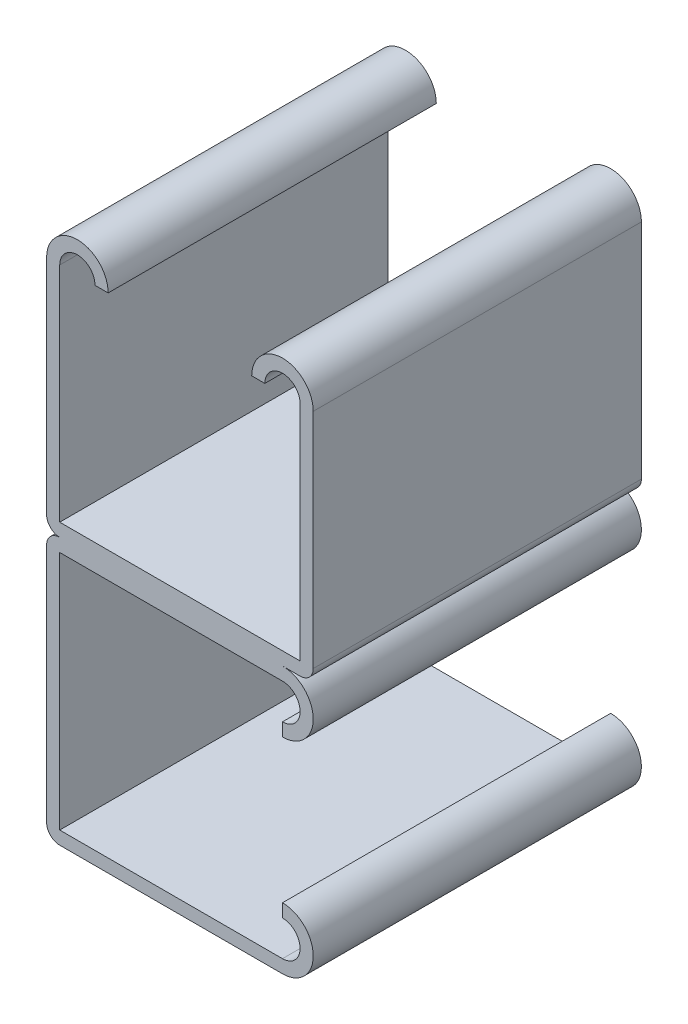
ISO-10303-21;
HEADER;
FILE_DESCRIPTION(('STEP AP214'),'2;1');
FILE_NAME('part.step','',(''),(''),'','','');
FILE_SCHEMA(('AUTOMOTIVE_DESIGN { 1 0 10303 214 1 1 1 1 }'));
ENDSEC;
DATA;
#1=APPLICATION_CONTEXT('core data for automotive mechanical design processes');
#2=APPLICATION_PROTOCOL_DEFINITION('international standard','automotive_design',2000,#1);
#3=PRODUCT_CONTEXT('',#1,'mechanical');
#4=PRODUCT('Part','Part','',(#3));
#5=PRODUCT_RELATED_PRODUCT_CATEGORY('part','',(#4));
#6=PRODUCT_DEFINITION_FORMATION('','',#4);
#7=PRODUCT_DEFINITION_CONTEXT('part definition',#1,'design');
#8=PRODUCT_DEFINITION('design','',#6,#7);
#9=PRODUCT_DEFINITION_SHAPE('','',#8);
#10=(LENGTH_UNIT() NAMED_UNIT(*) SI_UNIT(.MILLI.,.METRE.));
#11=(NAMED_UNIT(*) PLANE_ANGLE_UNIT() SI_UNIT($,.RADIAN.));
#12=(NAMED_UNIT(*) SI_UNIT($,.STERADIAN.) SOLID_ANGLE_UNIT());
#13=UNCERTAINTY_MEASURE_WITH_UNIT(LENGTH_MEASURE(1.E-05),#10,'distance_accuracy_value','');
#14=(GEOMETRIC_REPRESENTATION_CONTEXT(3) GLOBAL_UNCERTAINTY_ASSIGNED_CONTEXT((#13)) GLOBAL_UNIT_ASSIGNED_CONTEXT((#10,
#11,#12)) REPRESENTATION_CONTEXT('',''));
#15=CARTESIAN_POINT('',(0.,0.,0.));
#16=DIRECTION('',(0.,0.,1.));
#17=DIRECTION('',(1.,0.,0.));
#18=AXIS2_PLACEMENT_3D('',#15,#16,#17);
#19=CARTESIAN_POINT('',(1.016,0.,12.7));
#20=DIRECTION('',(0.,1.,0.));
#21=DIRECTION('',(0.,0.,1.));
#22=AXIS2_PLACEMENT_3D('',#19,#20,#21);
#23=PLANE('',#22);
#24=DIRECTION('',(0.,0.,-1.));
#25=VECTOR('',#24,1.);
#26=CARTESIAN_POINT('',(18.25625,1.89923025969782E-13,12.7));
#27=LINE('',#26,#25);
#28=CARTESIAN_POINT('',(18.25625,0.,12.7));
#29=VERTEX_POINT('',#28);
#30=CARTESIAN_POINT('',(18.25625,1.89923025969782E-13,-12.7));
#31=VERTEX_POINT('',#30);
#32=EDGE_CURVE('E180',#29,#31,#27,.T.);
#33=ORIENTED_EDGE('',*,*,#32,.T.);
#34=DIRECTION('',(1.,0.,0.));
#35=VECTOR('',#34,1.);
#36=CARTESIAN_POINT('',(1.016,0.,-12.7));
#37=LINE('',#36,#35);
#38=CARTESIAN_POINT('',(19.6215,0.,-12.7));
#39=VERTEX_POINT('',#38);
#40=EDGE_CURVE('E184',#31,#39,#37,.T.);
#41=ORIENTED_EDGE('',*,*,#40,.T.);
#42=DIRECTION('',(0.,0.,-1.));
#43=VECTOR('',#42,1.);
#44=CARTESIAN_POINT('',(19.6215,0.,12.7));
#45=LINE('',#44,#43);
#46=CARTESIAN_POINT('',(19.6215,0.,12.7));
#47=VERTEX_POINT('',#46);
#48=EDGE_CURVE('E226',#47,#39,#45,.T.);
#49=ORIENTED_EDGE('',*,*,#48,.F.);
#50=DIRECTION('',(1.,0.,0.));
#51=VECTOR('',#50,1.);
#52=CARTESIAN_POINT('',(1.016,0.,12.7));
#53=LINE('',#52,#51);
#54=EDGE_CURVE('E47',#29,#47,#53,.T.);
#55=ORIENTED_EDGE('',*,*,#54,.F.);
#56=EDGE_LOOP('',(#33,#41,#49,#55));
#57=FACE_BOUND('',#56,.T.);
#58=ADVANCED_FACE('F32',(#57),#23,.F.);
#59=CARTESIAN_POINT('',(2.38125,18.25625,12.7));
#60=DIRECTION('',(0.,0.,-1.));
#61=DIRECTION('',(-1.,0.,0.));
#62=AXIS2_PLACEMENT_3D('',#59,#60,#61);
#63=CYLINDRICAL_SURFACE('',#62,2.38125);
#64=CARTESIAN_POINT('',(2.38125,18.25625,-12.7));
#65=DIRECTION('',(0.,0.,1.));
#66=DIRECTION('',(-1.,0.,0.));
#67=AXIS2_PLACEMENT_3D('',#64,#65,#66);
#68=CIRCLE('',#67,2.38125);
#69=CARTESIAN_POINT('',(4.7625,18.25625,-12.7));
#70=VERTEX_POINT('',#69);
#71=CARTESIAN_POINT('',(0.,18.25625,-12.7));
#72=VERTEX_POINT('',#71);
#73=EDGE_CURVE('E176',#70,#72,#68,.T.);
#74=ORIENTED_EDGE('',*,*,#73,.T.);
#75=DIRECTION('',(0.,0.,-1.));
#76=VECTOR('',#75,1.);
#77=CARTESIAN_POINT('',(0.,18.25625,12.7));
#78=LINE('',#77,#76);
#79=CARTESIAN_POINT('',(0.,18.25625,12.7));
#80=VERTEX_POINT('',#79);
#81=EDGE_CURVE('E11',#80,#72,#78,.T.);
#82=ORIENTED_EDGE('',*,*,#81,.F.);
#83=CARTESIAN_POINT('',(2.38125,18.25625,12.7));
#84=DIRECTION('',(0.,0.,1.));
#85=DIRECTION('',(-1.,0.,0.));
#86=AXIS2_PLACEMENT_3D('',#83,#84,#85);
#87=CIRCLE('',#86,2.38125);
#88=CARTESIAN_POINT('',(4.7625,18.25625,12.7));
#89=VERTEX_POINT('',#88);
#90=EDGE_CURVE('E204',#89,#80,#87,.T.);
#91=ORIENTED_EDGE('',*,*,#90,.F.);
#92=DIRECTION('',(0.,0.,-1.));
#93=VECTOR('',#92,1.);
#94=CARTESIAN_POINT('',(4.7625,18.25625,12.7));
#95=LINE('',#94,#93);
#96=EDGE_CURVE('E172',#89,#70,#95,.T.);
#97=ORIENTED_EDGE('',*,*,#96,.T.);
#98=EDGE_LOOP('',(#74,#82,#91,#97));
#99=FACE_BOUND('',#98,.T.);
#100=ADVANCED_FACE('F34',(#99),#63,.T.);
#101=CARTESIAN_POINT('',(0.,18.25625,12.7));
#102=DIRECTION('',(1.,0.,0.));
#103=DIRECTION('',(0.,1.,0.));
#104=AXIS2_PLACEMENT_3D('',#101,#102,#103);
#105=PLANE('',#104);
#106=DIRECTION('',(0.,-1.,0.));
#107=VECTOR('',#106,1.);
#108=CARTESIAN_POINT('',(0.,18.25625,-12.7));
#109=LINE('',#108,#107);
#110=CARTESIAN_POINT('',(0.,1.016,-12.7));
#111=VERTEX_POINT('',#110);
#112=EDGE_CURVE('E179',#72,#111,#109,.T.);
#113=ORIENTED_EDGE('',*,*,#112,.T.);
#114=DIRECTION('',(0.,0.,-1.));
#115=VECTOR('',#114,1.);
#116=CARTESIAN_POINT('',(0.,1.016,12.7));
#117=LINE('',#116,#115);
#118=CARTESIAN_POINT('',(0.,1.016,12.7));
#119=VERTEX_POINT('',#118);
#120=EDGE_CURVE('E40',#119,#111,#117,.T.);
#121=ORIENTED_EDGE('',*,*,#120,.F.);
#122=DIRECTION('',(0.,-1.,0.));
#123=VECTOR('',#122,1.);
#124=CARTESIAN_POINT('',(0.,18.25625,12.7));
#125=LINE('',#124,#123);
#126=EDGE_CURVE('E115',#80,#119,#125,.T.);
#127=ORIENTED_EDGE('',*,*,#126,.F.);
#128=ORIENTED_EDGE('',*,*,#81,.T.);
#129=EDGE_LOOP('',(#113,#121,#127,#128));
#130=FACE_BOUND('',#129,.T.);
#131=ADVANCED_FACE('F511',(#130),#105,.F.);
#132=CARTESIAN_POINT('',(1.016,1.016,12.7));
#133=DIRECTION('',(0.,0.,-1.));
#134=DIRECTION('',(-1.,0.,0.));
#135=AXIS2_PLACEMENT_3D('',#132,#133,#134);
#136=CYLINDRICAL_SURFACE('',#135,1.016);
#137=CARTESIAN_POINT('',(1.016,1.016,-12.7));
#138=DIRECTION('',(0.,0.,1.));
#139=DIRECTION('',(-1.,0.,0.));
#140=AXIS2_PLACEMENT_3D('',#137,#138,#139);
#141=CIRCLE('',#140,1.016);
#142=CARTESIAN_POINT('',(1.016,0.,-12.7));
#143=VERTEX_POINT('',#142);
#144=EDGE_CURVE('E182',#111,#143,#141,.T.);
#145=ORIENTED_EDGE('',*,*,#144,.T.);
#146=DIRECTION('',(0.,0.,-1.));
#147=VECTOR('',#146,1.);
#148=CARTESIAN_POINT('',(1.016,0.,12.7));
#149=LINE('',#148,#147);
#150=CARTESIAN_POINT('',(1.016,0.,12.7));
#151=VERTEX_POINT('',#150);
#152=EDGE_CURVE('E229',#151,#143,#149,.T.);
#153=ORIENTED_EDGE('',*,*,#152,.F.);
#154=CARTESIAN_POINT('',(1.016,1.016,12.7));
#155=DIRECTION('',(0.,0.,1.));
#156=DIRECTION('',(-1.,0.,0.));
#157=AXIS2_PLACEMENT_3D('',#154,#155,#156);
#158=CIRCLE('',#157,1.016);
#159=EDGE_CURVE('E237',#119,#151,#158,.T.);
#160=ORIENTED_EDGE('',*,*,#159,.F.);
#161=ORIENTED_EDGE('',*,*,#120,.T.);
#162=EDGE_LOOP('',(#145,#153,#160,#161));
#163=FACE_BOUND('',#162,.T.);
#164=ADVANCED_FACE('F235',(#163),#136,.T.);
#165=CARTESIAN_POINT('',(19.6215,1.016,12.7));
#166=DIRECTION('',(0.,0.,-1.));
#167=DIRECTION('',(-1.,0.,0.));
#168=AXIS2_PLACEMENT_3D('',#165,#166,#167);
#169=CYLINDRICAL_SURFACE('',#168,1.016);
#170=CARTESIAN_POINT('',(19.6215,1.016,-12.7));
#171=DIRECTION('',(0.,0.,1.));
#172=DIRECTION('',(1.,0.,0.));
#173=AXIS2_PLACEMENT_3D('',#170,#171,#172);
#174=CIRCLE('',#173,1.016);
#175=CARTESIAN_POINT('',(20.6375,1.016,-12.7));
#176=VERTEX_POINT('',#175);
#177=EDGE_CURVE('E186',#39,#176,#174,.T.);
#178=ORIENTED_EDGE('',*,*,#177,.T.);
#179=DIRECTION('',(0.,0.,-1.));
#180=VECTOR('',#179,1.);
#181=CARTESIAN_POINT('',(20.6375,1.016,12.7));
#182=LINE('',#181,#180);
#183=CARTESIAN_POINT('',(20.6375,1.016,12.7));
#184=VERTEX_POINT('',#183);
#185=EDGE_CURVE('E223',#184,#176,#182,.T.);
#186=ORIENTED_EDGE('',*,*,#185,.F.);
#187=CARTESIAN_POINT('',(19.6215,1.016,12.7));
#188=DIRECTION('',(0.,0.,1.));
#189=DIRECTION('',(1.,0.,0.));
#190=AXIS2_PLACEMENT_3D('',#187,#188,#189);
#191=CIRCLE('',#190,1.016);
#192=EDGE_CURVE('E331',#47,#184,#191,.T.);
#193=ORIENTED_EDGE('',*,*,#192,.F.);
#194=ORIENTED_EDGE('',*,*,#48,.T.);
#195=EDGE_LOOP('',(#178,#186,#193,#194));
#196=FACE_BOUND('',#195,.T.);
#197=ADVANCED_FACE('F514',(#196),#169,.T.);
#198=CARTESIAN_POINT('',(20.6375,1.016,12.7));
#199=DIRECTION('',(-1.,0.,0.));
#200=DIRECTION('',(0.,-1.,0.));
#201=AXIS2_PLACEMENT_3D('',#198,#199,#200);
#202=PLANE('',#201);
#203=DIRECTION('',(0.,1.,0.));
#204=VECTOR('',#203,1.);
#205=CARTESIAN_POINT('',(20.6375,1.016,-12.7));
#206=LINE('',#205,#204);
#207=CARTESIAN_POINT('',(20.6375,18.25625,-12.7));
#208=VERTEX_POINT('',#207);
#209=EDGE_CURVE('E188',#176,#208,#206,.T.);
#210=ORIENTED_EDGE('',*,*,#209,.T.);
#211=DIRECTION('',(0.,0.,-1.));
#212=VECTOR('',#211,1.);
#213=CARTESIAN_POINT('',(20.6375,18.25625,12.7));
#214=LINE('',#213,#212);
#215=CARTESIAN_POINT('',(20.6375,18.25625,12.7));
#216=VERTEX_POINT('',#215);
#217=EDGE_CURVE('E220',#216,#208,#214,.T.);
#218=ORIENTED_EDGE('',*,*,#217,.F.);
#219=DIRECTION('',(0.,1.,0.));
#220=VECTOR('',#219,1.);
#221=CARTESIAN_POINT('',(20.6375,1.016,12.7));
#222=LINE('',#221,#220);
#223=EDGE_CURVE('E333',#184,#216,#222,.T.);
#224=ORIENTED_EDGE('',*,*,#223,.F.);
#225=ORIENTED_EDGE('',*,*,#185,.T.);
#226=EDGE_LOOP('',(#210,#218,#224,#225));
#227=FACE_BOUND('',#226,.T.);
#228=ADVANCED_FACE('F533',(#227),#202,.F.);
#229=CARTESIAN_POINT('',(18.25625,18.25625,12.7));
#230=DIRECTION('',(0.,0.,-1.));
#231=DIRECTION('',(-1.,0.,0.));
#232=AXIS2_PLACEMENT_3D('',#229,#230,#231);
#233=CYLINDRICAL_SURFACE('',#232,2.38125);
#234=CARTESIAN_POINT('',(18.25625,18.25625,-12.7));
#235=DIRECTION('',(0.,0.,1.));
#236=DIRECTION('',(1.,0.,0.));
#237=AXIS2_PLACEMENT_3D('',#234,#235,#236);
#238=CIRCLE('',#237,2.38125);
#239=CARTESIAN_POINT('',(15.875,18.25625,-12.7));
#240=VERTEX_POINT('',#239);
#241=EDGE_CURVE('E190',#208,#240,#238,.T.);
#242=ORIENTED_EDGE('',*,*,#241,.T.);
#243=DIRECTION('',(0.,0.,-1.));
#244=VECTOR('',#243,1.);
#245=CARTESIAN_POINT('',(15.875,18.25625,12.7));
#246=LINE('',#245,#244);
#247=CARTESIAN_POINT('',(15.875,18.25625,12.7));
#248=VERTEX_POINT('',#247);
#249=EDGE_CURVE('E217',#248,#240,#246,.T.);
#250=ORIENTED_EDGE('',*,*,#249,.F.);
#251=CARTESIAN_POINT('',(18.25625,18.25625,12.7));
#252=DIRECTION('',(0.,0.,1.));
#253=DIRECTION('',(1.,0.,0.));
#254=AXIS2_PLACEMENT_3D('',#251,#252,#253);
#255=CIRCLE('',#254,2.38125);
#256=EDGE_CURVE('E335',#216,#248,#255,.T.);
#257=ORIENTED_EDGE('',*,*,#256,.F.);
#258=ORIENTED_EDGE('',*,*,#217,.T.);
#259=EDGE_LOOP('',(#242,#250,#257,#258));
#260=FACE_BOUND('',#259,.T.);
#261=ADVANCED_FACE('F540',(#260),#233,.T.);
#262=CARTESIAN_POINT('',(16.891,18.25625,12.7));
#263=DIRECTION('',(0.,1.,0.));
#264=DIRECTION('',(0.,0.,1.));
#265=AXIS2_PLACEMENT_3D('',#262,#263,#264);
#266=PLANE('',#265);
#267=DIRECTION('',(1.,0.,0.));
#268=VECTOR('',#267,1.);
#269=CARTESIAN_POINT('',(16.891,18.25625,-12.7));
#270=LINE('',#269,#268);
#271=CARTESIAN_POINT('',(16.891,18.25625,-12.7));
#272=VERTEX_POINT('',#271);
#273=EDGE_CURVE('E192',#240,#272,#270,.T.);
#274=ORIENTED_EDGE('',*,*,#273,.T.);
#275=DIRECTION('',(0.,0.,-1.));
#276=VECTOR('',#275,1.);
#277=CARTESIAN_POINT('',(16.891,18.25625,12.7));
#278=LINE('',#277,#276);
#279=CARTESIAN_POINT('',(16.891,18.25625,12.7));
#280=VERTEX_POINT('',#279);
#281=EDGE_CURVE('E214',#280,#272,#278,.T.);
#282=ORIENTED_EDGE('',*,*,#281,.F.);
#283=DIRECTION('',(1.,0.,0.));
#284=VECTOR('',#283,1.);
#285=CARTESIAN_POINT('',(16.891,18.25625,12.7));
#286=LINE('',#285,#284);
#287=EDGE_CURVE('E337',#248,#280,#286,.T.);
#288=ORIENTED_EDGE('',*,*,#287,.F.);
#289=ORIENTED_EDGE('',*,*,#249,.T.);
#290=EDGE_LOOP('',(#274,#282,#288,#289));
#291=FACE_BOUND('',#290,.T.);
#292=ADVANCED_FACE('F547',(#291),#266,.F.);
#293=CARTESIAN_POINT('',(18.25625,18.25625,12.7));
#294=DIRECTION('',(0.,0.,-1.));
#295=DIRECTION('',(-1.,0.,0.));
#296=AXIS2_PLACEMENT_3D('',#293,#294,#295);
#297=CYLINDRICAL_SURFACE('',#296,1.36525);
#298=CARTESIAN_POINT('',(18.25625,18.25625,-12.7));
#299=DIRECTION('',(0.,0.,-1.));
#300=DIRECTION('',(1.,0.,0.));
#301=AXIS2_PLACEMENT_3D('',#298,#299,#300);
#302=CIRCLE('',#301,1.36525);
#303=CARTESIAN_POINT('',(19.6215,18.25625,-12.7));
#304=VERTEX_POINT('',#303);
#305=EDGE_CURVE('E194',#272,#304,#302,.T.);
#306=ORIENTED_EDGE('',*,*,#305,.T.);
#307=DIRECTION('',(0.,0.,-1.));
#308=VECTOR('',#307,1.);
#309=CARTESIAN_POINT('',(19.6215,18.25625,12.7));
#310=LINE('',#309,#308);
#311=CARTESIAN_POINT('',(19.6215,18.25625,12.7));
#312=VERTEX_POINT('',#311);
#313=EDGE_CURVE('E211',#312,#304,#310,.T.);
#314=ORIENTED_EDGE('',*,*,#313,.F.);
#315=CARTESIAN_POINT('',(18.25625,18.25625,12.7));
#316=DIRECTION('',(0.,0.,-1.));
#317=DIRECTION('',(1.,0.,0.));
#318=AXIS2_PLACEMENT_3D('',#315,#316,#317);
#319=CIRCLE('',#318,1.36525);
#320=EDGE_CURVE('E339',#280,#312,#319,.T.);
#321=ORIENTED_EDGE('',*,*,#320,.F.);
#322=ORIENTED_EDGE('',*,*,#281,.T.);
#323=EDGE_LOOP('',(#306,#314,#321,#322));
#324=FACE_BOUND('',#323,.T.);
#325=ADVANCED_FACE('F555',(#324),#297,.F.);
#326=CARTESIAN_POINT('',(19.6215,1.016,12.7));
#327=DIRECTION('',(1.,0.,0.));
#328=DIRECTION('',(0.,1.,0.));
#329=AXIS2_PLACEMENT_3D('',#326,#327,#328);
#330=PLANE('',#329);
#331=DIRECTION('',(0.,-1.,0.));
#332=VECTOR('',#331,1.);
#333=CARTESIAN_POINT('',(19.6215,1.016,-12.7));
#334=LINE('',#333,#332);
#335=CARTESIAN_POINT('',(19.6215,1.016,-12.7));
#336=VERTEX_POINT('',#335);
#337=EDGE_CURVE('E196',#304,#336,#334,.T.);
#338=ORIENTED_EDGE('',*,*,#337,.T.);
#339=DIRECTION('',(0.,0.,-1.));
#340=VECTOR('',#339,1.);
#341=CARTESIAN_POINT('',(19.6215,1.016,12.7));
#342=LINE('',#341,#340);
#343=CARTESIAN_POINT('',(19.6215,1.016,12.7));
#344=VERTEX_POINT('',#343);
#345=EDGE_CURVE('E208',#344,#336,#342,.T.);
#346=ORIENTED_EDGE('',*,*,#345,.F.);
#347=DIRECTION('',(0.,-1.,0.));
#348=VECTOR('',#347,1.);
#349=CARTESIAN_POINT('',(19.6215,1.016,12.7));
#350=LINE('',#349,#348);
#351=EDGE_CURVE('E341',#312,#344,#350,.T.);
#352=ORIENTED_EDGE('',*,*,#351,.F.);
#353=ORIENTED_EDGE('',*,*,#313,.T.);
#354=EDGE_LOOP('',(#338,#346,#352,#353));
#355=FACE_BOUND('',#354,.T.);
#356=ADVANCED_FACE('F347',(#355),#330,.F.);
#357=CARTESIAN_POINT('',(1.016,1.016,12.7));
#358=DIRECTION('',(0.,-1.,0.));
#359=DIRECTION('',(1.,0.,0.));
#360=AXIS2_PLACEMENT_3D('',#357,#358,#359);
#361=PLANE('',#360);
#362=DIRECTION('',(-1.,0.,0.));
#363=VECTOR('',#362,1.);
#364=CARTESIAN_POINT('',(1.016,1.016,-12.7));
#365=LINE('',#364,#363);
#366=CARTESIAN_POINT('',(1.016,1.016,-12.7));
#367=VERTEX_POINT('',#366);
#368=EDGE_CURVE('E198',#336,#367,#365,.T.);
#369=ORIENTED_EDGE('',*,*,#368,.T.);
#370=DIRECTION('',(0.,0.,-1.));
#371=VECTOR('',#370,1.);
#372=CARTESIAN_POINT('',(1.016,1.016,12.7));
#373=LINE('',#372,#371);
#374=CARTESIAN_POINT('',(1.016,1.016,12.7));
#375=VERTEX_POINT('',#374);
#376=EDGE_CURVE('E167',#375,#367,#373,.T.);
#377=ORIENTED_EDGE('',*,*,#376,.F.);
#378=DIRECTION('',(-1.,0.,0.));
#379=VECTOR('',#378,1.);
#380=CARTESIAN_POINT('',(1.016,1.016,12.7));
#381=LINE('',#380,#379);
#382=EDGE_CURVE('E155',#344,#375,#381,.T.);
#383=ORIENTED_EDGE('',*,*,#382,.F.);
#384=ORIENTED_EDGE('',*,*,#345,.T.);
#385=EDGE_LOOP('',(#369,#377,#383,#384));
#386=FACE_BOUND('',#385,.T.);
#387=ADVANCED_FACE('F351',(#386),#361,.F.);
#388=CARTESIAN_POINT('',(1.016,18.25625,12.7));
#389=DIRECTION('',(-1.,0.,0.));
#390=DIRECTION('',(0.,-1.,0.));
#391=AXIS2_PLACEMENT_3D('',#388,#389,#390);
#392=PLANE('',#391);
#393=DIRECTION('',(0.,1.,0.));
#394=VECTOR('',#393,1.);
#395=CARTESIAN_POINT('',(1.016,18.25625,-12.7));
#396=LINE('',#395,#394);
#397=CARTESIAN_POINT('',(1.016,18.25625,-12.7));
#398=VERTEX_POINT('',#397);
#399=EDGE_CURVE('E164',#367,#398,#396,.T.);
#400=ORIENTED_EDGE('',*,*,#399,.T.);
#401=DIRECTION('',(0.,0.,-1.));
#402=VECTOR('',#401,1.);
#403=CARTESIAN_POINT('',(1.016,18.25625,12.7));
#404=LINE('',#403,#402);
#405=CARTESIAN_POINT('',(1.016,18.25625,12.7));
#406=VERTEX_POINT('',#405);
#407=EDGE_CURVE('E161',#406,#398,#404,.T.);
#408=ORIENTED_EDGE('',*,*,#407,.F.);
#409=DIRECTION('',(0.,1.,0.));
#410=VECTOR('',#409,1.);
#411=CARTESIAN_POINT('',(1.016,18.25625,12.7));
#412=LINE('',#411,#410);
#413=EDGE_CURVE('E148',#375,#406,#412,.T.);
#414=ORIENTED_EDGE('',*,*,#413,.F.);
#415=ORIENTED_EDGE('',*,*,#376,.T.);
#416=EDGE_LOOP('',(#400,#408,#414,#415));
#417=FACE_BOUND('',#416,.T.);
#418=ADVANCED_FACE('F162',(#417),#392,.F.);
#419=CARTESIAN_POINT('',(2.38125,18.25625,12.7));
#420=DIRECTION('',(0.,0.,-1.));
#421=DIRECTION('',(-1.,0.,0.));
#422=AXIS2_PLACEMENT_3D('',#419,#420,#421);
#423=CYLINDRICAL_SURFACE('',#422,1.36525);
#424=CARTESIAN_POINT('',(2.38125,18.25625,-12.7));
#425=DIRECTION('',(0.,0.,-1.));
#426=DIRECTION('',(-1.,0.,0.));
#427=AXIS2_PLACEMENT_3D('',#424,#425,#426);
#428=CIRCLE('',#427,1.36525);
#429=CARTESIAN_POINT('',(3.7465,18.25625,-12.7));
#430=VERTEX_POINT('',#429);
#431=EDGE_CURVE('E201',#398,#430,#428,.T.);
#432=ORIENTED_EDGE('',*,*,#431,.T.);
#433=DIRECTION('',(0.,0.,-1.));
#434=VECTOR('',#433,1.);
#435=CARTESIAN_POINT('',(3.7465,18.25625,12.7));
#436=LINE('',#435,#434);
#437=CARTESIAN_POINT('',(3.7465,18.25625,12.7));
#438=VERTEX_POINT('',#437);
#439=EDGE_CURVE('E168',#438,#430,#436,.T.);
#440=ORIENTED_EDGE('',*,*,#439,.F.);
#441=CARTESIAN_POINT('',(2.38125,18.25625,12.7));
#442=DIRECTION('',(0.,0.,-1.));
#443=DIRECTION('',(-1.,0.,0.));
#444=AXIS2_PLACEMENT_3D('',#441,#442,#443);
#445=CIRCLE('',#444,1.36525);
#446=EDGE_CURVE('E152',#406,#438,#445,.T.);
#447=ORIENTED_EDGE('',*,*,#446,.F.);
#448=ORIENTED_EDGE('',*,*,#407,.T.);
#449=EDGE_LOOP('',(#432,#440,#447,#448));
#450=FACE_BOUND('',#449,.T.);
#451=ADVANCED_FACE('F170',(#450),#423,.F.);
#452=CARTESIAN_POINT('',(4.7625,18.25625,12.7));
#453=DIRECTION('',(0.,1.,0.));
#454=DIRECTION('',(0.,0.,1.));
#455=AXIS2_PLACEMENT_3D('',#452,#453,#454);
#456=PLANE('',#455);
#457=DIRECTION('',(1.,0.,0.));
#458=VECTOR('',#457,1.);
#459=CARTESIAN_POINT('',(4.7625,18.25625,-12.7));
#460=LINE('',#459,#458);
#461=EDGE_CURVE('E107',#430,#70,#460,.T.);
#462=ORIENTED_EDGE('',*,*,#461,.T.);
#463=ORIENTED_EDGE('',*,*,#96,.F.);
#464=DIRECTION('',(1.,0.,0.));
#465=VECTOR('',#464,1.);
#466=CARTESIAN_POINT('',(4.7625,18.25625,12.7));
#467=LINE('',#466,#465);
#468=EDGE_CURVE('E56',#438,#89,#467,.T.);
#469=ORIENTED_EDGE('',*,*,#468,.F.);
#470=ORIENTED_EDGE('',*,*,#439,.T.);
#471=EDGE_LOOP('',(#462,#463,#469,#470));
#472=FACE_BOUND('',#471,.T.);
#473=ADVANCED_FACE('F352',(#472),#456,.F.);
#474=CARTESIAN_POINT('',(2.38125,18.25625,12.7));
#475=DIRECTION('',(0.,0.,-1.));
#476=DIRECTION('',(-1.,0.,0.));
#477=AXIS2_PLACEMENT_3D('',#474,#475,#476);
#478=PLANE('',#477);
#479=ORIENTED_EDGE('',*,*,#90,.T.);
#480=ORIENTED_EDGE('',*,*,#126,.T.);
#481=ORIENTED_EDGE('',*,*,#159,.T.);
#482=CARTESIAN_POINT('',(1.01600000000001,-1.01599999999999,12.7));
#483=DIRECTION('',(0.,0.,1.));
#484=DIRECTION('',(0.,1.,0.));
#485=AXIS2_PLACEMENT_3D('',#482,#483,#484);
#486=CIRCLE('',#485,1.016);
#487=CARTESIAN_POINT('',(0.,-1.016,12.7));
#488=VERTEX_POINT('',#487);
#489=EDGE_CURVE('E360',#151,#488,#486,.T.);
#490=ORIENTED_EDGE('',*,*,#489,.T.);
#491=DIRECTION('',(0.,-1.,0.));
#492=VECTOR('',#491,1.);
#493=CARTESIAN_POINT('',(0.,-1.016,12.7));
#494=LINE('',#493,#492);
#495=CARTESIAN_POINT('',(2.05524303270332E-13,-19.6215,12.7));
#496=VERTEX_POINT('',#495);
#497=EDGE_CURVE('E363',#488,#496,#494,.T.);
#498=ORIENTED_EDGE('',*,*,#497,.T.);
#499=CARTESIAN_POINT('',(1.01600000000021,-19.6215,12.7));
#500=DIRECTION('',(0.,0.,1.));
#501=DIRECTION('',(0.,-1.,0.));
#502=AXIS2_PLACEMENT_3D('',#499,#500,#501);
#503=CIRCLE('',#502,1.016);
#504=CARTESIAN_POINT('',(1.01600000000022,-20.6375,12.7));
#505=VERTEX_POINT('',#504);
#506=EDGE_CURVE('E365',#496,#505,#503,.T.);
#507=ORIENTED_EDGE('',*,*,#506,.T.);
#508=DIRECTION('',(1.,0.,0.));
#509=VECTOR('',#508,1.);
#510=CARTESIAN_POINT('',(1.01600000000022,-20.6375,12.7));
#511=LINE('',#510,#509);
#512=CARTESIAN_POINT('',(18.2562500000002,-20.6374999999998,12.7));
#513=VERTEX_POINT('',#512);
#514=EDGE_CURVE('E371',#505,#513,#511,.T.);
#515=ORIENTED_EDGE('',*,*,#514,.T.);
#516=CARTESIAN_POINT('',(18.2562500000002,-18.2562499999998,12.7));
#517=DIRECTION('',(0.,0.,1.));
#518=DIRECTION('',(0.,-1.,0.));
#519=AXIS2_PLACEMENT_3D('',#516,#517,#518);
#520=CIRCLE('',#519,2.38125);
#521=CARTESIAN_POINT('',(18.2562500000002,-15.8749999999998,12.7));
#522=VERTEX_POINT('',#521);
#523=EDGE_CURVE('E374',#513,#522,#520,.T.);
#524=ORIENTED_EDGE('',*,*,#523,.T.);
#525=DIRECTION('',(0.,-1.,0.));
#526=VECTOR('',#525,1.);
#527=CARTESIAN_POINT('',(18.2562500000002,-16.8909999999998,12.7));
#528=LINE('',#527,#526);
#529=CARTESIAN_POINT('',(18.2562500000002,-16.8909999999998,12.7));
#530=VERTEX_POINT('',#529);
#531=EDGE_CURVE('E377',#522,#530,#528,.T.);
#532=ORIENTED_EDGE('',*,*,#531,.T.);
#533=CARTESIAN_POINT('',(18.2562500000002,-18.2562499999998,12.7));
#534=DIRECTION('',(0.,0.,-1.));
#535=DIRECTION('',(0.,-1.,0.));
#536=AXIS2_PLACEMENT_3D('',#533,#534,#535);
#537=CIRCLE('',#536,1.36525);
#538=CARTESIAN_POINT('',(18.2562500000002,-19.6214999999998,12.7));
#539=VERTEX_POINT('',#538);
#540=EDGE_CURVE('E380',#530,#539,#537,.T.);
#541=ORIENTED_EDGE('',*,*,#540,.T.);
#542=DIRECTION('',(-1.,0.,0.));
#543=VECTOR('',#542,1.);
#544=CARTESIAN_POINT('',(1.01600000000021,-19.6215,12.7));
#545=LINE('',#544,#543);
#546=CARTESIAN_POINT('',(1.01600000000021,-19.6215,12.7));
#547=VERTEX_POINT('',#546);
#548=EDGE_CURVE('E383',#539,#547,#545,.T.);
#549=ORIENTED_EDGE('',*,*,#548,.T.);
#550=DIRECTION('',(0.,1.,0.));
#551=VECTOR('',#550,1.);
#552=CARTESIAN_POINT('',(1.01600000000001,-1.01599999999999,12.7));
#553=LINE('',#552,#551);
#554=CARTESIAN_POINT('',(1.01600000000001,-1.01599999999999,12.7));
#555=VERTEX_POINT('',#554);
#556=EDGE_CURVE('E386',#547,#555,#553,.T.);
#557=ORIENTED_EDGE('',*,*,#556,.T.);
#558=DIRECTION('',(1.,0.,0.));
#559=VECTOR('',#558,1.);
#560=CARTESIAN_POINT('',(18.25625,-1.01599999999981,12.7));
#561=LINE('',#560,#559);
#562=CARTESIAN_POINT('',(18.25625,-1.01599999999981,12.7));
#563=VERTEX_POINT('',#562);
#564=EDGE_CURVE('E389',#555,#563,#561,.T.);
#565=ORIENTED_EDGE('',*,*,#564,.T.);
#566=CARTESIAN_POINT('',(18.25625,-2.38124999999981,12.7));
#567=DIRECTION('',(0.,0.,-1.));
#568=DIRECTION('',(0.,1.,0.));
#569=AXIS2_PLACEMENT_3D('',#566,#567,#568);
#570=CIRCLE('',#569,1.36525);
#571=CARTESIAN_POINT('',(18.25625,-3.74649999999981,12.7));
#572=VERTEX_POINT('',#571);
#573=EDGE_CURVE('E392',#563,#572,#570,.T.);
#574=ORIENTED_EDGE('',*,*,#573,.T.);
#575=DIRECTION('',(0.,-1.,0.));
#576=VECTOR('',#575,1.);
#577=CARTESIAN_POINT('',(18.2562500000001,-4.76249999999981,12.7));
#578=LINE('',#577,#576);
#579=CARTESIAN_POINT('',(18.2562500000001,-4.76249999999981,12.7));
#580=VERTEX_POINT('',#579);
#581=EDGE_CURVE('E294',#572,#580,#578,.T.);
#582=ORIENTED_EDGE('',*,*,#581,.T.);
#583=CARTESIAN_POINT('',(18.25625,-2.38124999999981,12.7));
#584=DIRECTION('',(0.,0.,1.));
#585=DIRECTION('',(0.,1.,0.));
#586=AXIS2_PLACEMENT_3D('',#583,#584,#585);
#587=CIRCLE('',#586,2.38125);
#588=EDGE_CURVE('E289',#580,#29,#587,.T.);
#589=ORIENTED_EDGE('',*,*,#588,.T.);
#590=ORIENTED_EDGE('',*,*,#54,.T.);
#591=ORIENTED_EDGE('',*,*,#192,.T.);
#592=ORIENTED_EDGE('',*,*,#223,.T.);
#593=ORIENTED_EDGE('',*,*,#256,.T.);
#594=ORIENTED_EDGE('',*,*,#287,.T.);
#595=ORIENTED_EDGE('',*,*,#320,.T.);
#596=ORIENTED_EDGE('',*,*,#351,.T.);
#597=ORIENTED_EDGE('',*,*,#382,.T.);
#598=ORIENTED_EDGE('',*,*,#413,.T.);
#599=ORIENTED_EDGE('',*,*,#446,.T.);
#600=ORIENTED_EDGE('',*,*,#468,.T.);
#601=EDGE_LOOP('',(#479,#480,#481,#490,#498,#507,#515,#524,#532,#541,#549,#557,#565,#574,#582,
#589,#590,#591,#592,#593,#594,#595,#596,#597,#598,#599,#600));
#602=FACE_BOUND('',#601,.T.);
#603=ADVANCED_FACE('F150',(#602),#478,.F.);
#604=CARTESIAN_POINT('',(2.38125,18.25625,-12.7));
#605=DIRECTION('',(0.,0.,-1.));
#606=DIRECTION('',(-1.,0.,0.));
#607=AXIS2_PLACEMENT_3D('',#604,#605,#606);
#608=PLANE('',#607);
#609=ORIENTED_EDGE('',*,*,#73,.F.);
#610=ORIENTED_EDGE('',*,*,#461,.F.);
#611=ORIENTED_EDGE('',*,*,#431,.F.);
#612=ORIENTED_EDGE('',*,*,#399,.F.);
#613=ORIENTED_EDGE('',*,*,#368,.F.);
#614=ORIENTED_EDGE('',*,*,#337,.F.);
#615=ORIENTED_EDGE('',*,*,#305,.F.);
#616=ORIENTED_EDGE('',*,*,#273,.F.);
#617=ORIENTED_EDGE('',*,*,#241,.F.);
#618=ORIENTED_EDGE('',*,*,#209,.F.);
#619=ORIENTED_EDGE('',*,*,#177,.F.);
#620=ORIENTED_EDGE('',*,*,#40,.F.);
#621=CARTESIAN_POINT('',(18.25625,-2.38124999999981,-12.7));
#622=DIRECTION('',(0.,0.,1.));
#623=DIRECTION('',(0.,1.,0.));
#624=AXIS2_PLACEMENT_3D('',#621,#622,#623);
#625=CIRCLE('',#624,2.38125);
#626=CARTESIAN_POINT('',(18.2562500000001,-4.76249999999981,-12.7));
#627=VERTEX_POINT('',#626);
#628=EDGE_CURVE('E252',#627,#31,#625,.T.);
#629=ORIENTED_EDGE('',*,*,#628,.F.);
#630=DIRECTION('',(0.,-1.,0.));
#631=VECTOR('',#630,1.);
#632=CARTESIAN_POINT('',(18.2562500000001,-4.76249999999981,-12.7));
#633=LINE('',#632,#631);
#634=CARTESIAN_POINT('',(18.25625,-3.74649999999981,-12.7));
#635=VERTEX_POINT('',#634);
#636=EDGE_CURVE('E286',#635,#627,#633,.T.);
#637=ORIENTED_EDGE('',*,*,#636,.F.);
#638=CARTESIAN_POINT('',(18.25625,-2.38124999999981,-12.7));
#639=DIRECTION('',(0.,0.,-1.));
#640=DIRECTION('',(0.,1.,0.));
#641=AXIS2_PLACEMENT_3D('',#638,#639,#640);
#642=CIRCLE('',#641,1.36525);
#643=CARTESIAN_POINT('',(18.25625,-1.01599999999981,-12.7));
#644=VERTEX_POINT('',#643);
#645=EDGE_CURVE('E283',#644,#635,#642,.T.);
#646=ORIENTED_EDGE('',*,*,#645,.F.);
#647=DIRECTION('',(1.,0.,0.));
#648=VECTOR('',#647,1.);
#649=CARTESIAN_POINT('',(18.25625,-1.01599999999981,-12.7));
#650=LINE('',#649,#648);
#651=CARTESIAN_POINT('',(1.01600000000001,-1.01599999999999,-12.7));
#652=VERTEX_POINT('',#651);
#653=EDGE_CURVE('E280',#652,#644,#650,.T.);
#654=ORIENTED_EDGE('',*,*,#653,.F.);
#655=DIRECTION('',(0.,1.,0.));
#656=VECTOR('',#655,1.);
#657=CARTESIAN_POINT('',(1.01600000000001,-1.01599999999999,-12.7));
#658=LINE('',#657,#656);
#659=CARTESIAN_POINT('',(1.01600000000021,-19.6215,-12.7));
#660=VERTEX_POINT('',#659);
#661=EDGE_CURVE('E277',#660,#652,#658,.T.);
#662=ORIENTED_EDGE('',*,*,#661,.F.);
#663=DIRECTION('',(-1.,0.,0.));
#664=VECTOR('',#663,1.);
#665=CARTESIAN_POINT('',(1.01600000000021,-19.6215,-12.7));
#666=LINE('',#665,#664);
#667=CARTESIAN_POINT('',(18.2562500000002,-19.6214999999998,-12.7));
#668=VERTEX_POINT('',#667);
#669=EDGE_CURVE('E274',#668,#660,#666,.T.);
#670=ORIENTED_EDGE('',*,*,#669,.F.);
#671=CARTESIAN_POINT('',(18.2562500000002,-18.2562499999998,-12.7));
#672=DIRECTION('',(0.,0.,-1.));
#673=DIRECTION('',(0.,-1.,0.));
#674=AXIS2_PLACEMENT_3D('',#671,#672,#673);
#675=CIRCLE('',#674,1.36525);
#676=CARTESIAN_POINT('',(18.2562500000002,-16.8909999999998,-12.7));
#677=VERTEX_POINT('',#676);
#678=EDGE_CURVE('E271',#677,#668,#675,.T.);
#679=ORIENTED_EDGE('',*,*,#678,.F.);
#680=DIRECTION('',(0.,-1.,0.));
#681=VECTOR('',#680,1.);
#682=CARTESIAN_POINT('',(18.2562500000002,-16.8909999999998,-12.7));
#683=LINE('',#682,#681);
#684=CARTESIAN_POINT('',(18.2562500000002,-15.8749999999998,-12.7));
#685=VERTEX_POINT('',#684);
#686=EDGE_CURVE('E268',#685,#677,#683,.T.);
#687=ORIENTED_EDGE('',*,*,#686,.F.);
#688=CARTESIAN_POINT('',(18.2562500000002,-18.2562499999998,-12.7));
#689=DIRECTION('',(0.,0.,1.));
#690=DIRECTION('',(0.,-1.,0.));
#691=AXIS2_PLACEMENT_3D('',#688,#689,#690);
#692=CIRCLE('',#691,2.38125);
#693=CARTESIAN_POINT('',(18.2562500000002,-20.6374999999998,-12.7));
#694=VERTEX_POINT('',#693);
#695=EDGE_CURVE('E265',#694,#685,#692,.T.);
#696=ORIENTED_EDGE('',*,*,#695,.F.);
#697=DIRECTION('',(1.,0.,0.));
#698=VECTOR('',#697,1.);
#699=CARTESIAN_POINT('',(1.01600000000022,-20.6375,-12.7));
#700=LINE('',#699,#698);
#701=CARTESIAN_POINT('',(1.01600000000022,-20.6375,-12.7));
#702=VERTEX_POINT('',#701);
#703=EDGE_CURVE('E262',#702,#694,#700,.T.);
#704=ORIENTED_EDGE('',*,*,#703,.F.);
#705=CARTESIAN_POINT('',(1.01600000000021,-19.6215,-12.7));
#706=DIRECTION('',(0.,0.,1.));
#707=DIRECTION('',(0.,-1.,0.));
#708=AXIS2_PLACEMENT_3D('',#705,#706,#707);
#709=CIRCLE('',#708,1.016);
#710=CARTESIAN_POINT('',(2.05524303270332E-13,-19.6215,-12.7));
#711=VERTEX_POINT('',#710);
#712=EDGE_CURVE('E254',#711,#702,#709,.T.);
#713=ORIENTED_EDGE('',*,*,#712,.F.);
#714=DIRECTION('',(0.,-1.,0.));
#715=VECTOR('',#714,1.);
#716=CARTESIAN_POINT('',(0.,-1.016,-12.7));
#717=LINE('',#716,#715);
#718=CARTESIAN_POINT('',(0.,-1.016,-12.7));
#719=VERTEX_POINT('',#718);
#720=EDGE_CURVE('E248',#719,#711,#717,.T.);
#721=ORIENTED_EDGE('',*,*,#720,.F.);
#722=CARTESIAN_POINT('',(1.01600000000001,-1.01599999999999,-12.7));
#723=DIRECTION('',(0.,0.,1.));
#724=DIRECTION('',(0.,1.,0.));
#725=AXIS2_PLACEMENT_3D('',#722,#723,#724);
#726=CIRCLE('',#725,1.016);
#727=EDGE_CURVE('E244',#143,#719,#726,.T.);
#728=ORIENTED_EDGE('',*,*,#727,.F.);
#729=ORIENTED_EDGE('',*,*,#144,.F.);
#730=ORIENTED_EDGE('',*,*,#112,.F.);
#731=EDGE_LOOP('',(#609,#610,#611,#612,#613,#614,#615,#616,#617,#618,#619,#620,#629,#637,#646,
#654,#662,#670,#679,#687,#696,#704,#713,#721,#728,#729,#730));
#732=FACE_BOUND('',#731,.T.);
#733=ADVANCED_FACE('F241',(#732),#608,.T.);
#734=CARTESIAN_POINT('',(18.25625,-2.38124999999981,12.7));
#735=DIRECTION('',(0.,0.,-1.));
#736=DIRECTION('',(-1.,0.,0.));
#737=AXIS2_PLACEMENT_3D('',#734,#735,#736);
#738=CYLINDRICAL_SURFACE('',#737,2.38125);
#739=ORIENTED_EDGE('',*,*,#628,.T.);
#740=ORIENTED_EDGE('',*,*,#32,.F.);
#741=ORIENTED_EDGE('',*,*,#588,.F.);
#742=DIRECTION('',(0.,0.,-1.));
#743=VECTOR('',#742,1.);
#744=CARTESIAN_POINT('',(18.2562500000001,-4.76249999999981,12.7));
#745=LINE('',#744,#743);
#746=EDGE_CURVE('E290',#580,#627,#745,.T.);
#747=ORIENTED_EDGE('',*,*,#746,.T.);
#748=EDGE_LOOP('',(#739,#740,#741,#747));
#749=FACE_BOUND('',#748,.T.);
#750=ADVANCED_FACE('F408',(#749),#738,.T.);
#751=CARTESIAN_POINT('',(1.01600000000001,-1.01599999999999,12.7));
#752=DIRECTION('',(0.,0.,-1.));
#753=DIRECTION('',(-1.,0.,0.));
#754=AXIS2_PLACEMENT_3D('',#751,#752,#753);
#755=CYLINDRICAL_SURFACE('',#754,1.016);
#756=ORIENTED_EDGE('',*,*,#727,.T.);
#757=DIRECTION('',(0.,0.,-1.));
#758=VECTOR('',#757,1.);
#759=CARTESIAN_POINT('',(0.,-1.016,12.7));
#760=LINE('',#759,#758);
#761=EDGE_CURVE('E324',#488,#719,#760,.T.);
#762=ORIENTED_EDGE('',*,*,#761,.F.);
#763=ORIENTED_EDGE('',*,*,#489,.F.);
#764=ORIENTED_EDGE('',*,*,#152,.T.);
#765=EDGE_LOOP('',(#756,#762,#763,#764));
#766=FACE_BOUND('',#765,.T.);
#767=ADVANCED_FACE('F361',(#766),#755,.T.);
#768=CARTESIAN_POINT('',(0.,-1.016,12.7));
#769=DIRECTION('',(1.,0.,0.));
#770=DIRECTION('',(0.,1.,0.));
#771=AXIS2_PLACEMENT_3D('',#768,#769,#770);
#772=PLANE('',#771);
#773=ORIENTED_EDGE('',*,*,#720,.T.);
#774=DIRECTION('',(0.,0.,-1.));
#775=VECTOR('',#774,1.);
#776=CARTESIAN_POINT('',(2.05524303270332E-13,-19.6215,12.7));
#777=LINE('',#776,#775);
#778=EDGE_CURVE('E321',#496,#711,#777,.T.);
#779=ORIENTED_EDGE('',*,*,#778,.F.);
#780=ORIENTED_EDGE('',*,*,#497,.F.);
#781=ORIENTED_EDGE('',*,*,#761,.T.);
#782=EDGE_LOOP('',(#773,#779,#780,#781));
#783=FACE_BOUND('',#782,.T.);
#784=ADVANCED_FACE('F497',(#783),#772,.F.);
#785=CARTESIAN_POINT('',(1.01600000000021,-19.6215,12.7));
#786=DIRECTION('',(0.,0.,-1.));
#787=DIRECTION('',(-1.,0.,0.));
#788=AXIS2_PLACEMENT_3D('',#785,#786,#787);
#789=CYLINDRICAL_SURFACE('',#788,1.016);
#790=ORIENTED_EDGE('',*,*,#712,.T.);
#791=DIRECTION('',(0.,0.,-1.));
#792=VECTOR('',#791,1.);
#793=CARTESIAN_POINT('',(1.01600000000022,-20.6375,12.7));
#794=LINE('',#793,#792);
#795=EDGE_CURVE('E318',#505,#702,#794,.T.);
#796=ORIENTED_EDGE('',*,*,#795,.F.);
#797=ORIENTED_EDGE('',*,*,#506,.F.);
#798=ORIENTED_EDGE('',*,*,#778,.T.);
#799=EDGE_LOOP('',(#790,#796,#797,#798));
#800=FACE_BOUND('',#799,.T.);
#801=ADVANCED_FACE('F493',(#800),#789,.T.);
#802=CARTESIAN_POINT('',(1.01600000000022,-20.6375,12.7));
#803=DIRECTION('',(0.,1.,0.));
#804=DIRECTION('',(-1.,0.,0.));
#805=AXIS2_PLACEMENT_3D('',#802,#803,#804);
#806=PLANE('',#805);
#807=ORIENTED_EDGE('',*,*,#703,.T.);
#808=DIRECTION('',(0.,0.,-1.));
#809=VECTOR('',#808,1.);
#810=CARTESIAN_POINT('',(18.2562500000002,-20.6374999999998,12.7));
#811=LINE('',#810,#809);
#812=EDGE_CURVE('E315',#513,#694,#811,.T.);
#813=ORIENTED_EDGE('',*,*,#812,.F.);
#814=ORIENTED_EDGE('',*,*,#514,.F.);
#815=ORIENTED_EDGE('',*,*,#795,.T.);
#816=EDGE_LOOP('',(#807,#813,#814,#815));
#817=FACE_BOUND('',#816,.T.);
#818=ADVANCED_FACE('F490',(#817),#806,.F.);
#819=CARTESIAN_POINT('',(18.2562500000002,-18.2562499999998,12.7));
#820=DIRECTION('',(0.,0.,-1.));
#821=DIRECTION('',(-1.,0.,0.));
#822=AXIS2_PLACEMENT_3D('',#819,#820,#821);
#823=CYLINDRICAL_SURFACE('',#822,2.38125);
#824=ORIENTED_EDGE('',*,*,#695,.T.);
#825=DIRECTION('',(0.,0.,-1.));
#826=VECTOR('',#825,1.);
#827=CARTESIAN_POINT('',(18.2562500000002,-15.8749999999998,12.7));
#828=LINE('',#827,#826);
#829=EDGE_CURVE('E312',#522,#685,#828,.T.);
#830=ORIENTED_EDGE('',*,*,#829,.F.);
#831=ORIENTED_EDGE('',*,*,#523,.F.);
#832=ORIENTED_EDGE('',*,*,#812,.T.);
#833=EDGE_LOOP('',(#824,#830,#831,#832));
#834=FACE_BOUND('',#833,.T.);
#835=ADVANCED_FACE('F486',(#834),#823,.T.);
#836=CARTESIAN_POINT('',(18.2562500000002,-16.8909999999998,12.7));
#837=DIRECTION('',(1.,0.,0.));
#838=DIRECTION('',(0.,1.,0.));
#839=AXIS2_PLACEMENT_3D('',#836,#837,#838);
#840=PLANE('',#839);
#841=ORIENTED_EDGE('',*,*,#686,.T.);
#842=DIRECTION('',(0.,0.,-1.));
#843=VECTOR('',#842,1.);
#844=CARTESIAN_POINT('',(18.2562500000002,-16.8909999999998,12.7));
#845=LINE('',#844,#843);
#846=EDGE_CURVE('E309',#530,#677,#845,.T.);
#847=ORIENTED_EDGE('',*,*,#846,.F.);
#848=ORIENTED_EDGE('',*,*,#531,.F.);
#849=ORIENTED_EDGE('',*,*,#829,.T.);
#850=EDGE_LOOP('',(#841,#847,#848,#849));
#851=FACE_BOUND('',#850,.T.);
#852=ADVANCED_FACE('F481',(#851),#840,.F.);
#853=CARTESIAN_POINT('',(18.2562500000002,-18.2562499999998,12.7));
#854=DIRECTION('',(0.,0.,-1.));
#855=DIRECTION('',(-1.,0.,0.));
#856=AXIS2_PLACEMENT_3D('',#853,#854,#855);
#857=CYLINDRICAL_SURFACE('',#856,1.36525);
#858=ORIENTED_EDGE('',*,*,#678,.T.);
#859=DIRECTION('',(0.,0.,-1.));
#860=VECTOR('',#859,1.);
#861=CARTESIAN_POINT('',(18.2562500000002,-19.6214999999998,12.7));
#862=LINE('',#861,#860);
#863=EDGE_CURVE('E306',#539,#668,#862,.T.);
#864=ORIENTED_EDGE('',*,*,#863,.F.);
#865=ORIENTED_EDGE('',*,*,#540,.F.);
#866=ORIENTED_EDGE('',*,*,#846,.T.);
#867=EDGE_LOOP('',(#858,#864,#865,#866));
#868=FACE_BOUND('',#867,.T.);
#869=ADVANCED_FACE('F475',(#868),#857,.F.);
#870=CARTESIAN_POINT('',(1.01600000000021,-19.6215,12.7));
#871=DIRECTION('',(0.,-1.,0.));
#872=DIRECTION('',(1.,0.,0.));
#873=AXIS2_PLACEMENT_3D('',#870,#871,#872);
#874=PLANE('',#873);
#875=ORIENTED_EDGE('',*,*,#669,.T.);
#876=DIRECTION('',(0.,0.,-1.));
#877=VECTOR('',#876,1.);
#878=CARTESIAN_POINT('',(1.01600000000021,-19.6215,12.7));
#879=LINE('',#878,#877);
#880=EDGE_CURVE('E303',#547,#660,#879,.T.);
#881=ORIENTED_EDGE('',*,*,#880,.F.);
#882=ORIENTED_EDGE('',*,*,#548,.F.);
#883=ORIENTED_EDGE('',*,*,#863,.T.);
#884=EDGE_LOOP('',(#875,#881,#882,#883));
#885=FACE_BOUND('',#884,.T.);
#886=ADVANCED_FACE('F471',(#885),#874,.F.);
#887=CARTESIAN_POINT('',(1.01600000000001,-1.01599999999999,12.7));
#888=DIRECTION('',(-1.,0.,0.));
#889=DIRECTION('',(0.,-1.,0.));
#890=AXIS2_PLACEMENT_3D('',#887,#888,#889);
#891=PLANE('',#890);
#892=ORIENTED_EDGE('',*,*,#661,.T.);
#893=DIRECTION('',(0.,0.,-1.));
#894=VECTOR('',#893,1.);
#895=CARTESIAN_POINT('',(1.01600000000001,-1.01599999999999,12.7));
#896=LINE('',#895,#894);
#897=EDGE_CURVE('E300',#555,#652,#896,.T.);
#898=ORIENTED_EDGE('',*,*,#897,.F.);
#899=ORIENTED_EDGE('',*,*,#556,.F.);
#900=ORIENTED_EDGE('',*,*,#880,.T.);
#901=EDGE_LOOP('',(#892,#898,#899,#900));
#902=FACE_BOUND('',#901,.T.);
#903=ADVANCED_FACE('F467',(#902),#891,.F.);
#904=CARTESIAN_POINT('',(18.25625,-1.01599999999981,12.7));
#905=DIRECTION('',(0.,1.,0.));
#906=DIRECTION('',(-1.,0.,0.));
#907=AXIS2_PLACEMENT_3D('',#904,#905,#906);
#908=PLANE('',#907);
#909=ORIENTED_EDGE('',*,*,#653,.T.);
#910=DIRECTION('',(0.,0.,-1.));
#911=VECTOR('',#910,1.);
#912=CARTESIAN_POINT('',(18.25625,-1.01599999999981,12.7));
#913=LINE('',#912,#911);
#914=EDGE_CURVE('E297',#563,#644,#913,.T.);
#915=ORIENTED_EDGE('',*,*,#914,.F.);
#916=ORIENTED_EDGE('',*,*,#564,.F.);
#917=ORIENTED_EDGE('',*,*,#897,.T.);
#918=EDGE_LOOP('',(#909,#915,#916,#917));
#919=FACE_BOUND('',#918,.T.);
#920=ADVANCED_FACE('F460',(#919),#908,.F.);
#921=CARTESIAN_POINT('',(18.25625,-2.38124999999981,12.7));
#922=DIRECTION('',(0.,0.,-1.));
#923=DIRECTION('',(-1.,0.,0.));
#924=AXIS2_PLACEMENT_3D('',#921,#922,#923);
#925=CYLINDRICAL_SURFACE('',#924,1.36525);
#926=ORIENTED_EDGE('',*,*,#645,.T.);
#927=DIRECTION('',(0.,0.,-1.));
#928=VECTOR('',#927,1.);
#929=CARTESIAN_POINT('',(18.25625,-3.74649999999981,12.7));
#930=LINE('',#929,#928);
#931=EDGE_CURVE('E293',#572,#635,#930,.T.);
#932=ORIENTED_EDGE('',*,*,#931,.F.);
#933=ORIENTED_EDGE('',*,*,#573,.F.);
#934=ORIENTED_EDGE('',*,*,#914,.T.);
#935=EDGE_LOOP('',(#926,#932,#933,#934));
#936=FACE_BOUND('',#935,.T.);
#937=ADVANCED_FACE('F462',(#936),#925,.F.);
#938=CARTESIAN_POINT('',(18.2562500000001,-4.76249999999981,12.7));
#939=DIRECTION('',(1.,0.,0.));
#940=DIRECTION('',(0.,1.,0.));
#941=AXIS2_PLACEMENT_3D('',#938,#939,#940);
#942=PLANE('',#941);
#943=ORIENTED_EDGE('',*,*,#636,.T.);
#944=ORIENTED_EDGE('',*,*,#746,.F.);
#945=ORIENTED_EDGE('',*,*,#581,.F.);
#946=ORIENTED_EDGE('',*,*,#931,.T.);
#947=EDGE_LOOP('',(#943,#944,#945,#946));
#948=FACE_BOUND('',#947,.T.);
#949=ADVANCED_FACE('F404',(#948),#942,.F.);
#950=CLOSED_SHELL('',(#58,#100,#131,#164,#197,#228,#261,#292,#325,#356,#387,#418,#451,#473,#603,
#733,#750,#767,#784,#801,#818,#835,#852,#869,#886,#903,#920,#937,#949));
#951=MANIFOLD_SOLID_BREP('B2',#950);
#952=ADVANCED_BREP_SHAPE_REPRESENTATION('',(#18,#951),#14);
#953=SHAPE_DEFINITION_REPRESENTATION(#9,#952);
ENDSEC;
END-ISO-10303-21;
